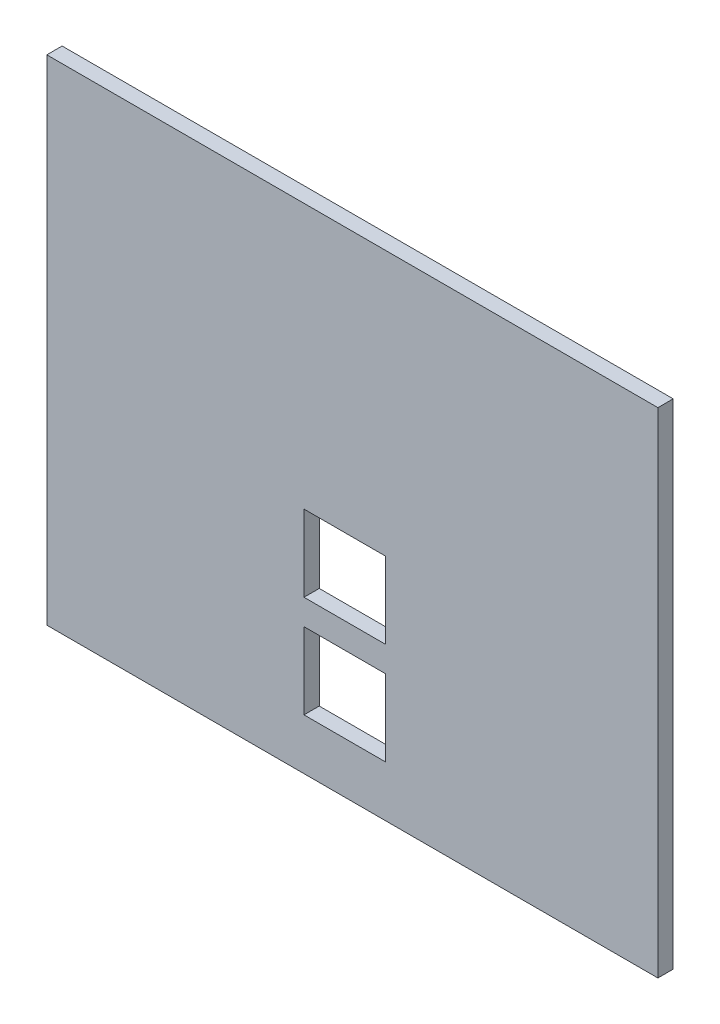
ISO-10303-21;
HEADER;
FILE_DESCRIPTION(('STEP AP214'),'2;1');
FILE_NAME('part.step','',(''),(''),'','','');
FILE_SCHEMA(('AUTOMOTIVE_DESIGN { 1 0 10303 214 1 1 1 1 }'));
ENDSEC;
DATA;
#1=APPLICATION_CONTEXT('core data for automotive mechanical design processes');
#2=APPLICATION_PROTOCOL_DEFINITION('international standard','automotive_design',2000,#1);
#3=PRODUCT_CONTEXT('',#1,'mechanical');
#4=PRODUCT('Part','Part','',(#3));
#5=PRODUCT_RELATED_PRODUCT_CATEGORY('part','',(#4));
#6=PRODUCT_DEFINITION_FORMATION('','',#4);
#7=PRODUCT_DEFINITION_CONTEXT('part definition',#1,'design');
#8=PRODUCT_DEFINITION('design','',#6,#7);
#9=PRODUCT_DEFINITION_SHAPE('','',#8);
#10=(LENGTH_UNIT() NAMED_UNIT(*) SI_UNIT(.MILLI.,.METRE.));
#11=(NAMED_UNIT(*) PLANE_ANGLE_UNIT() SI_UNIT($,.RADIAN.));
#12=(NAMED_UNIT(*) SI_UNIT($,.STERADIAN.) SOLID_ANGLE_UNIT());
#13=UNCERTAINTY_MEASURE_WITH_UNIT(LENGTH_MEASURE(1.E-05),#10,'distance_accuracy_value','');
#14=(GEOMETRIC_REPRESENTATION_CONTEXT(3) GLOBAL_UNCERTAINTY_ASSIGNED_CONTEXT((#13)) GLOBAL_UNIT_ASSIGNED_CONTEXT((#10,
#11,#12)) REPRESENTATION_CONTEXT('',''));
#15=CARTESIAN_POINT('',(0.,0.,0.));
#16=DIRECTION('',(0.,0.,1.));
#17=DIRECTION('',(1.,0.,0.));
#18=AXIS2_PLACEMENT_3D('',#15,#16,#17);
#19=CARTESIAN_POINT('',(-60.,-48.5,3.));
#20=DIRECTION('',(1.,0.,0.));
#21=DIRECTION('',(0.,0.,-1.));
#22=AXIS2_PLACEMENT_3D('',#19,#20,#21);
#23=PLANE('',#22);
#24=DIRECTION('',(0.,-1.,0.));
#25=VECTOR('',#24,1.);
#26=CARTESIAN_POINT('',(-60.,-48.5,0.));
#27=LINE('',#26,#25);
#28=CARTESIAN_POINT('',(-60.,48.5,0.));
#29=VERTEX_POINT('',#28);
#30=CARTESIAN_POINT('',(-60.,-48.5,0.));
#31=VERTEX_POINT('',#30);
#32=EDGE_CURVE('E212',#29,#31,#27,.T.);
#33=ORIENTED_EDGE('',*,*,#32,.T.);
#34=DIRECTION('',(0.,0.,-1.));
#35=VECTOR('',#34,1.);
#36=CARTESIAN_POINT('',(-60.,-48.5,3.));
#37=LINE('',#36,#35);
#38=CARTESIAN_POINT('',(-60.,-48.5,3.));
#39=VERTEX_POINT('',#38);
#40=EDGE_CURVE('E11',#39,#31,#37,.T.);
#41=ORIENTED_EDGE('',*,*,#40,.F.);
#42=DIRECTION('',(0.,-1.,0.));
#43=VECTOR('',#42,1.);
#44=CARTESIAN_POINT('',(-60.,-48.5,3.));
#45=LINE('',#44,#43);
#46=CARTESIAN_POINT('',(-60.,48.5,3.));
#47=VERTEX_POINT('',#46);
#48=EDGE_CURVE('E222',#47,#39,#45,.T.);
#49=ORIENTED_EDGE('',*,*,#48,.F.);
#50=DIRECTION('',(0.,0.,-1.));
#51=VECTOR('',#50,1.);
#52=CARTESIAN_POINT('',(-60.,48.5,3.));
#53=LINE('',#52,#51);
#54=EDGE_CURVE('E236',#47,#29,#53,.T.);
#55=ORIENTED_EDGE('',*,*,#54,.T.);
#56=EDGE_LOOP('',(#33,#41,#49,#55));
#57=FACE_BOUND('',#56,.T.);
#58=ADVANCED_FACE('F40',(#57),#23,.F.);
#59=CARTESIAN_POINT('',(60.,-48.5,3.));
#60=DIRECTION('',(0.,1.,0.));
#61=DIRECTION('',(-1.,0.,0.));
#62=AXIS2_PLACEMENT_3D('',#59,#60,#61);
#63=PLANE('',#62);
#64=DIRECTION('',(1.,0.,0.));
#65=VECTOR('',#64,1.);
#66=CARTESIAN_POINT('',(60.,-48.5,0.));
#67=LINE('',#66,#65);
#68=CARTESIAN_POINT('',(60.,-48.5,0.));
#69=VERTEX_POINT('',#68);
#70=EDGE_CURVE('E240',#31,#69,#67,.T.);
#71=ORIENTED_EDGE('',*,*,#70,.T.);
#72=DIRECTION('',(0.,0.,-1.));
#73=VECTOR('',#72,1.);
#74=CARTESIAN_POINT('',(60.,-48.5,3.));
#75=LINE('',#74,#73);
#76=CARTESIAN_POINT('',(60.,-48.5,3.));
#77=VERTEX_POINT('',#76);
#78=EDGE_CURVE('E48',#77,#69,#75,.T.);
#79=ORIENTED_EDGE('',*,*,#78,.F.);
#80=DIRECTION('',(1.,0.,0.));
#81=VECTOR('',#80,1.);
#82=CARTESIAN_POINT('',(60.,-48.5,3.));
#83=LINE('',#82,#81);
#84=EDGE_CURVE('E226',#39,#77,#83,.T.);
#85=ORIENTED_EDGE('',*,*,#84,.F.);
#86=ORIENTED_EDGE('',*,*,#40,.T.);
#87=EDGE_LOOP('',(#71,#79,#85,#86));
#88=FACE_BOUND('',#87,.T.);
#89=ADVANCED_FACE('F275',(#88),#63,.F.);
#90=CARTESIAN_POINT('',(60.,-48.5,3.));
#91=DIRECTION('',(-1.,0.,0.));
#92=DIRECTION('',(0.,0.,1.));
#93=AXIS2_PLACEMENT_3D('',#90,#91,#92);
#94=PLANE('',#93);
#95=DIRECTION('',(0.,1.,0.));
#96=VECTOR('',#95,1.);
#97=CARTESIAN_POINT('',(60.,-48.5,0.));
#98=LINE('',#97,#96);
#99=CARTESIAN_POINT('',(60.,48.5,0.));
#100=VERTEX_POINT('',#99);
#101=EDGE_CURVE('E243',#69,#100,#98,.T.);
#102=ORIENTED_EDGE('',*,*,#101,.T.);
#103=DIRECTION('',(0.,0.,-1.));
#104=VECTOR('',#103,1.);
#105=CARTESIAN_POINT('',(60.,48.5,3.));
#106=LINE('',#105,#104);
#107=CARTESIAN_POINT('',(60.,48.5,3.));
#108=VERTEX_POINT('',#107);
#109=EDGE_CURVE('E251',#108,#100,#106,.T.);
#110=ORIENTED_EDGE('',*,*,#109,.F.);
#111=DIRECTION('',(0.,1.,0.));
#112=VECTOR('',#111,1.);
#113=CARTESIAN_POINT('',(60.,-48.5,3.));
#114=LINE('',#113,#112);
#115=EDGE_CURVE('E230',#77,#108,#114,.T.);
#116=ORIENTED_EDGE('',*,*,#115,.F.);
#117=ORIENTED_EDGE('',*,*,#78,.T.);
#118=EDGE_LOOP('',(#102,#110,#116,#117));
#119=FACE_BOUND('',#118,.T.);
#120=ADVANCED_FACE('F260',(#119),#94,.F.);
#121=CARTESIAN_POINT('',(60.,48.5,3.));
#122=DIRECTION('',(0.,-1.,0.));
#123=DIRECTION('',(1.,0.,0.));
#124=AXIS2_PLACEMENT_3D('',#121,#122,#123);
#125=PLANE('',#124);
#126=DIRECTION('',(-1.,0.,0.));
#127=VECTOR('',#126,1.);
#128=CARTESIAN_POINT('',(60.,48.5,0.));
#129=LINE('',#128,#127);
#130=EDGE_CURVE('E227',#100,#29,#129,.T.);
#131=ORIENTED_EDGE('',*,*,#130,.T.);
#132=ORIENTED_EDGE('',*,*,#54,.F.);
#133=DIRECTION('',(-1.,0.,0.));
#134=VECTOR('',#133,1.);
#135=CARTESIAN_POINT('',(60.,48.5,3.));
#136=LINE('',#135,#134);
#137=EDGE_CURVE('E233',#108,#47,#136,.T.);
#138=ORIENTED_EDGE('',*,*,#137,.F.);
#139=ORIENTED_EDGE('',*,*,#109,.T.);
#140=EDGE_LOOP('',(#131,#132,#138,#139));
#141=FACE_BOUND('',#140,.T.);
#142=ADVANCED_FACE('F268',(#141),#125,.F.);
#143=CARTESIAN_POINT('',(0.,0.,3.));
#144=DIRECTION('',(0.,0.,1.));
#145=DIRECTION('',(1.,0.,0.));
#146=AXIS2_PLACEMENT_3D('',#143,#144,#145);
#147=PLANE('',#146);
#148=DIRECTION('',(0.,-1.,0.));
#149=VECTOR('',#148,1.);
#150=CARTESIAN_POINT('',(-9.50000000000002,-3.50000000000001,3.));
#151=LINE('',#150,#149);
#152=CARTESIAN_POINT('',(-9.50000000000002,-3.50000000000001,3.));
#153=VERTEX_POINT('',#152);
#154=CARTESIAN_POINT('',(-9.50000000000002,-18.5,3.));
#155=VERTEX_POINT('',#154);
#156=EDGE_CURVE('E55',#153,#155,#151,.T.);
#157=ORIENTED_EDGE('',*,*,#156,.F.);
#158=DIRECTION('',(-1.,0.,0.));
#159=VECTOR('',#158,1.);
#160=CARTESIAN_POINT('',(-9.50000000000002,-3.50000000000001,3.));
#161=LINE('',#160,#159);
#162=CARTESIAN_POINT('',(6.49999999999998,-3.50000000000001,3.));
#163=VERTEX_POINT('',#162);
#164=EDGE_CURVE('E150',#163,#153,#161,.T.);
#165=ORIENTED_EDGE('',*,*,#164,.F.);
#166=DIRECTION('',(0.,1.,0.));
#167=VECTOR('',#166,1.);
#168=CARTESIAN_POINT('',(6.49999999999998,-3.50000000000001,3.));
#169=LINE('',#168,#167);
#170=CARTESIAN_POINT('',(6.49999999999998,-18.5,3.));
#171=VERTEX_POINT('',#170);
#172=EDGE_CURVE('E154',#171,#163,#169,.T.);
#173=ORIENTED_EDGE('',*,*,#172,.F.);
#174=DIRECTION('',(1.,0.,0.));
#175=VECTOR('',#174,1.);
#176=CARTESIAN_POINT('',(-9.50000000000002,-18.5,3.));
#177=LINE('',#176,#175);
#178=EDGE_CURVE('E163',#155,#171,#177,.T.);
#179=ORIENTED_EDGE('',*,*,#178,.F.);
#180=EDGE_LOOP('',(#157,#165,#173,#179));
#181=FACE_BOUND('',#180,.T.);
#182=DIRECTION('',(0.,-1.,0.));
#183=VECTOR('',#182,1.);
#184=CARTESIAN_POINT('',(-9.50000000000002,-23.5,3.));
#185=LINE('',#184,#183);
#186=CARTESIAN_POINT('',(-9.50000000000002,-23.5,3.));
#187=VERTEX_POINT('',#186);
#188=CARTESIAN_POINT('',(-9.50000000000002,-38.5,3.));
#189=VERTEX_POINT('',#188);
#190=EDGE_CURVE('E172',#187,#189,#185,.T.);
#191=ORIENTED_EDGE('',*,*,#190,.F.);
#192=DIRECTION('',(-1.,0.,0.));
#193=VECTOR('',#192,1.);
#194=CARTESIAN_POINT('',(-9.50000000000002,-23.5,3.));
#195=LINE('',#194,#193);
#196=CARTESIAN_POINT('',(6.49999999999998,-23.5,3.));
#197=VERTEX_POINT('',#196);
#198=EDGE_CURVE('E183',#197,#187,#195,.T.);
#199=ORIENTED_EDGE('',*,*,#198,.F.);
#200=DIRECTION('',(0.,1.,0.));
#201=VECTOR('',#200,1.);
#202=CARTESIAN_POINT('',(6.49999999999998,-23.5,3.));
#203=LINE('',#202,#201);
#204=CARTESIAN_POINT('',(6.49999999999998,-38.5,3.));
#205=VERTEX_POINT('',#204);
#206=EDGE_CURVE('E202',#205,#197,#203,.T.);
#207=ORIENTED_EDGE('',*,*,#206,.F.);
#208=DIRECTION('',(1.,0.,0.));
#209=VECTOR('',#208,1.);
#210=CARTESIAN_POINT('',(-9.50000000000002,-38.5,3.));
#211=LINE('',#210,#209);
#212=EDGE_CURVE('E198',#189,#205,#211,.T.);
#213=ORIENTED_EDGE('',*,*,#212,.F.);
#214=EDGE_LOOP('',(#191,#199,#207,#213));
#215=FACE_BOUND('',#214,.T.);
#216=ORIENTED_EDGE('',*,*,#48,.T.);
#217=ORIENTED_EDGE('',*,*,#84,.T.);
#218=ORIENTED_EDGE('',*,*,#115,.T.);
#219=ORIENTED_EDGE('',*,*,#137,.T.);
#220=EDGE_LOOP('',(#216,#217,#218,#219));
#221=FACE_BOUND('',#220,.T.);
#222=ADVANCED_FACE('F274',(#181,#215,#221),#147,.T.);
#223=CARTESIAN_POINT('',(0.,0.,0.));
#224=DIRECTION('',(0.,0.,1.));
#225=DIRECTION('',(1.,0.,0.));
#226=AXIS2_PLACEMENT_3D('',#223,#224,#225);
#227=PLANE('',#226);
#228=DIRECTION('',(-1.,0.,0.));
#229=VECTOR('',#228,1.);
#230=CARTESIAN_POINT('',(-9.50000000000002,-3.50000000000001,0.));
#231=LINE('',#230,#229);
#232=CARTESIAN_POINT('',(6.49999999999998,-3.50000000000001,0.));
#233=VERTEX_POINT('',#232);
#234=CARTESIAN_POINT('',(-9.50000000000002,-3.50000000000001,0.));
#235=VERTEX_POINT('',#234);
#236=EDGE_CURVE('E138',#233,#235,#231,.T.);
#237=ORIENTED_EDGE('',*,*,#236,.T.);
#238=DIRECTION('',(0.,-1.,0.));
#239=VECTOR('',#238,1.);
#240=CARTESIAN_POINT('',(-9.50000000000002,-3.50000000000001,0.));
#241=LINE('',#240,#239);
#242=CARTESIAN_POINT('',(-9.50000000000002,-18.5,0.));
#243=VERTEX_POINT('',#242);
#244=EDGE_CURVE('E131',#235,#243,#241,.T.);
#245=ORIENTED_EDGE('',*,*,#244,.T.);
#246=DIRECTION('',(1.,0.,0.));
#247=VECTOR('',#246,1.);
#248=CARTESIAN_POINT('',(-9.50000000000002,-18.5,0.));
#249=LINE('',#248,#247);
#250=CARTESIAN_POINT('',(6.49999999999998,-18.5,0.));
#251=VERTEX_POINT('',#250);
#252=EDGE_CURVE('E141',#243,#251,#249,.T.);
#253=ORIENTED_EDGE('',*,*,#252,.T.);
#254=DIRECTION('',(0.,1.,0.));
#255=VECTOR('',#254,1.);
#256=CARTESIAN_POINT('',(6.49999999999998,-3.50000000000001,0.));
#257=LINE('',#256,#255);
#258=EDGE_CURVE('E63',#251,#233,#257,.T.);
#259=ORIENTED_EDGE('',*,*,#258,.T.);
#260=EDGE_LOOP('',(#237,#245,#253,#259));
#261=FACE_BOUND('',#260,.T.);
#262=DIRECTION('',(-1.,0.,0.));
#263=VECTOR('',#262,1.);
#264=CARTESIAN_POINT('',(-9.50000000000002,-23.5,0.));
#265=LINE('',#264,#263);
#266=CARTESIAN_POINT('',(6.49999999999998,-23.5,0.));
#267=VERTEX_POINT('',#266);
#268=CARTESIAN_POINT('',(-9.50000000000002,-23.5,0.));
#269=VERTEX_POINT('',#268);
#270=EDGE_CURVE('E191',#267,#269,#265,.T.);
#271=ORIENTED_EDGE('',*,*,#270,.T.);
#272=DIRECTION('',(0.,-1.,0.));
#273=VECTOR('',#272,1.);
#274=CARTESIAN_POINT('',(-9.50000000000002,-23.5,0.));
#275=LINE('',#274,#273);
#276=CARTESIAN_POINT('',(-9.50000000000002,-38.5,0.));
#277=VERTEX_POINT('',#276);
#278=EDGE_CURVE('E178',#269,#277,#275,.T.);
#279=ORIENTED_EDGE('',*,*,#278,.T.);
#280=DIRECTION('',(1.,0.,0.));
#281=VECTOR('',#280,1.);
#282=CARTESIAN_POINT('',(-9.50000000000002,-38.5,0.));
#283=LINE('',#282,#281);
#284=CARTESIAN_POINT('',(6.49999999999998,-38.5,0.));
#285=VERTEX_POINT('',#284);
#286=EDGE_CURVE('E182',#277,#285,#283,.T.);
#287=ORIENTED_EDGE('',*,*,#286,.T.);
#288=DIRECTION('',(0.,1.,0.));
#289=VECTOR('',#288,1.);
#290=CARTESIAN_POINT('',(6.49999999999998,-23.5,0.));
#291=LINE('',#290,#289);
#292=EDGE_CURVE('E187',#285,#267,#291,.T.);
#293=ORIENTED_EDGE('',*,*,#292,.T.);
#294=EDGE_LOOP('',(#271,#279,#287,#293));
#295=FACE_BOUND('',#294,.T.);
#296=ORIENTED_EDGE('',*,*,#32,.F.);
#297=ORIENTED_EDGE('',*,*,#130,.F.);
#298=ORIENTED_EDGE('',*,*,#101,.F.);
#299=ORIENTED_EDGE('',*,*,#70,.F.);
#300=EDGE_LOOP('',(#296,#297,#298,#299));
#301=FACE_BOUND('',#300,.T.);
#302=ADVANCED_FACE('F146',(#261,#295,#301),#227,.F.);
#303=CARTESIAN_POINT('',(-9.50000000000002,-23.5,0.));
#304=DIRECTION('',(-1.,0.,0.));
#305=DIRECTION('',(0.,-1.,0.));
#306=AXIS2_PLACEMENT_3D('',#303,#304,#305);
#307=PLANE('',#306);
#308=ORIENTED_EDGE('',*,*,#190,.T.);
#309=DIRECTION('',(0.,0.,1.));
#310=VECTOR('',#309,1.);
#311=CARTESIAN_POINT('',(-9.50000000000002,-38.5,0.));
#312=LINE('',#311,#310);
#313=EDGE_CURVE('E195',#277,#189,#312,.T.);
#314=ORIENTED_EDGE('',*,*,#313,.F.);
#315=ORIENTED_EDGE('',*,*,#278,.F.);
#316=DIRECTION('',(0.,0.,1.));
#317=VECTOR('',#316,1.);
#318=CARTESIAN_POINT('',(-9.50000000000002,-23.5,0.));
#319=LINE('',#318,#317);
#320=EDGE_CURVE('E209',#269,#187,#319,.T.);
#321=ORIENTED_EDGE('',*,*,#320,.T.);
#322=EDGE_LOOP('',(#308,#314,#315,#321));
#323=FACE_BOUND('',#322,.T.);
#324=ADVANCED_FACE('F287',(#323),#307,.F.);
#325=CARTESIAN_POINT('',(-9.50000000000002,-23.5,0.));
#326=DIRECTION('',(0.,1.,0.));
#327=DIRECTION('',(-1.,0.,0.));
#328=AXIS2_PLACEMENT_3D('',#325,#326,#327);
#329=PLANE('',#328);
#330=ORIENTED_EDGE('',*,*,#198,.T.);
#331=ORIENTED_EDGE('',*,*,#320,.F.);
#332=ORIENTED_EDGE('',*,*,#270,.F.);
#333=DIRECTION('',(0.,0.,1.));
#334=VECTOR('',#333,1.);
#335=CARTESIAN_POINT('',(6.49999999999998,-23.5,0.));
#336=LINE('',#335,#334);
#337=EDGE_CURVE('E213',#267,#197,#336,.T.);
#338=ORIENTED_EDGE('',*,*,#337,.T.);
#339=EDGE_LOOP('',(#330,#331,#332,#338));
#340=FACE_BOUND('',#339,.T.);
#341=ADVANCED_FACE('F293',(#340),#329,.F.);
#342=CARTESIAN_POINT('',(6.49999999999998,-23.5,0.));
#343=DIRECTION('',(1.,0.,0.));
#344=DIRECTION('',(0.,1.,0.));
#345=AXIS2_PLACEMENT_3D('',#342,#343,#344);
#346=PLANE('',#345);
#347=ORIENTED_EDGE('',*,*,#206,.T.);
#348=ORIENTED_EDGE('',*,*,#337,.F.);
#349=ORIENTED_EDGE('',*,*,#292,.F.);
#350=DIRECTION('',(0.,0.,1.));
#351=VECTOR('',#350,1.);
#352=CARTESIAN_POINT('',(6.49999999999998,-38.5,0.));
#353=LINE('',#352,#351);
#354=EDGE_CURVE('E216',#285,#205,#353,.T.);
#355=ORIENTED_EDGE('',*,*,#354,.T.);
#356=EDGE_LOOP('',(#347,#348,#349,#355));
#357=FACE_BOUND('',#356,.T.);
#358=ADVANCED_FACE('F298',(#357),#346,.F.);
#359=CARTESIAN_POINT('',(-9.50000000000002,-38.5,0.));
#360=DIRECTION('',(0.,-1.,0.));
#361=DIRECTION('',(0.,0.,-1.));
#362=AXIS2_PLACEMENT_3D('',#359,#360,#361);
#363=PLANE('',#362);
#364=ORIENTED_EDGE('',*,*,#212,.T.);
#365=ORIENTED_EDGE('',*,*,#354,.F.);
#366=ORIENTED_EDGE('',*,*,#286,.F.);
#367=ORIENTED_EDGE('',*,*,#313,.T.);
#368=EDGE_LOOP('',(#364,#365,#366,#367));
#369=FACE_BOUND('',#368,.T.);
#370=ADVANCED_FACE('F295',(#369),#363,.F.);
#371=CARTESIAN_POINT('',(-9.50000000000002,-3.50000000000001,0.));
#372=DIRECTION('',(-1.,0.,0.));
#373=DIRECTION('',(0.,-1.,0.));
#374=AXIS2_PLACEMENT_3D('',#371,#372,#373);
#375=PLANE('',#374);
#376=ORIENTED_EDGE('',*,*,#156,.T.);
#377=DIRECTION('',(0.,0.,1.));
#378=VECTOR('',#377,1.);
#379=CARTESIAN_POINT('',(-9.50000000000002,-18.5,0.));
#380=LINE('',#379,#378);
#381=EDGE_CURVE('E127',#243,#155,#380,.T.);
#382=ORIENTED_EDGE('',*,*,#381,.F.);
#383=ORIENTED_EDGE('',*,*,#244,.F.);
#384=DIRECTION('',(0.,0.,1.));
#385=VECTOR('',#384,1.);
#386=CARTESIAN_POINT('',(-9.50000000000002,-3.50000000000001,0.));
#387=LINE('',#386,#385);
#388=EDGE_CURVE('E169',#235,#153,#387,.T.);
#389=ORIENTED_EDGE('',*,*,#388,.T.);
#390=EDGE_LOOP('',(#376,#382,#383,#389));
#391=FACE_BOUND('',#390,.T.);
#392=ADVANCED_FACE('F129',(#391),#375,.F.);
#393=CARTESIAN_POINT('',(-9.50000000000002,-3.50000000000001,0.));
#394=DIRECTION('',(0.,1.,0.));
#395=DIRECTION('',(-1.,0.,0.));
#396=AXIS2_PLACEMENT_3D('',#393,#394,#395);
#397=PLANE('',#396);
#398=ORIENTED_EDGE('',*,*,#164,.T.);
#399=ORIENTED_EDGE('',*,*,#388,.F.);
#400=ORIENTED_EDGE('',*,*,#236,.F.);
#401=DIRECTION('',(0.,0.,1.));
#402=VECTOR('',#401,1.);
#403=CARTESIAN_POINT('',(6.49999999999998,-3.50000000000001,0.));
#404=LINE('',#403,#402);
#405=EDGE_CURVE('E173',#233,#163,#404,.T.);
#406=ORIENTED_EDGE('',*,*,#405,.T.);
#407=EDGE_LOOP('',(#398,#399,#400,#406));
#408=FACE_BOUND('',#407,.T.);
#409=ADVANCED_FACE('F308',(#408),#397,.F.);
#410=CARTESIAN_POINT('',(6.49999999999998,-3.50000000000001,0.));
#411=DIRECTION('',(1.,0.,0.));
#412=DIRECTION('',(0.,1.,0.));
#413=AXIS2_PLACEMENT_3D('',#410,#411,#412);
#414=PLANE('',#413);
#415=ORIENTED_EDGE('',*,*,#172,.T.);
#416=ORIENTED_EDGE('',*,*,#405,.F.);
#417=ORIENTED_EDGE('',*,*,#258,.F.);
#418=DIRECTION('',(0.,0.,1.));
#419=VECTOR('',#418,1.);
#420=CARTESIAN_POINT('',(6.49999999999998,-18.5,0.));
#421=LINE('',#420,#419);
#422=EDGE_CURVE('E137',#251,#171,#421,.T.);
#423=ORIENTED_EDGE('',*,*,#422,.T.);
#424=EDGE_LOOP('',(#415,#416,#417,#423));
#425=FACE_BOUND('',#424,.T.);
#426=ADVANCED_FACE('F311',(#425),#414,.F.);
#427=CARTESIAN_POINT('',(-9.50000000000002,-18.5,0.));
#428=DIRECTION('',(0.,-1.,0.));
#429=DIRECTION('',(0.,0.,-1.));
#430=AXIS2_PLACEMENT_3D('',#427,#428,#429);
#431=PLANE('',#430);
#432=ORIENTED_EDGE('',*,*,#178,.T.);
#433=ORIENTED_EDGE('',*,*,#422,.F.);
#434=ORIENTED_EDGE('',*,*,#252,.F.);
#435=ORIENTED_EDGE('',*,*,#381,.T.);
#436=EDGE_LOOP('',(#432,#433,#434,#435));
#437=FACE_BOUND('',#436,.T.);
#438=ADVANCED_FACE('F142',(#437),#431,.F.);
#439=CLOSED_SHELL('',(#58,#89,#120,#142,#222,#302,#324,#341,#358,#370,#392,#409,#426,#438));
#440=MANIFOLD_SOLID_BREP('B2',#439);
#441=ADVANCED_BREP_SHAPE_REPRESENTATION('',(#18,#440),#14);
#442=SHAPE_DEFINITION_REPRESENTATION(#9,#441);
ENDSEC;
END-ISO-10303-21;
